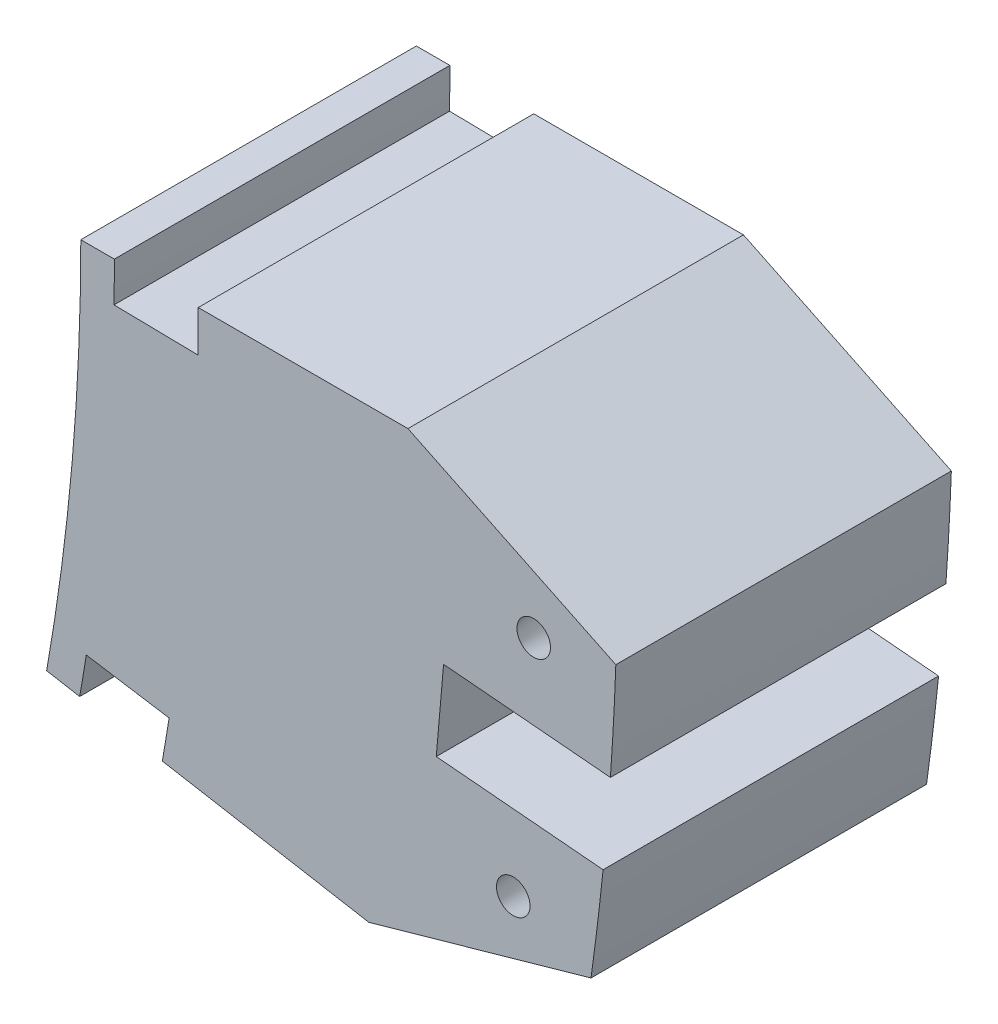
ISO-10303-21;
HEADER;
FILE_DESCRIPTION(('STEP AP214'),'2;1');
FILE_NAME('part.step','',(''),(''),'','','');
FILE_SCHEMA(('AUTOMOTIVE_DESIGN { 1 0 10303 214 1 1 1 1 }'));
ENDSEC;
DATA;
#1=APPLICATION_CONTEXT('core data for automotive mechanical design processes');
#2=APPLICATION_PROTOCOL_DEFINITION('international standard','automotive_design',2000,#1);
#3=PRODUCT_CONTEXT('',#1,'mechanical');
#4=PRODUCT('Part','Part','',(#3));
#5=PRODUCT_RELATED_PRODUCT_CATEGORY('part','',(#4));
#6=PRODUCT_DEFINITION_FORMATION('','',#4);
#7=PRODUCT_DEFINITION_CONTEXT('part definition',#1,'design');
#8=PRODUCT_DEFINITION('design','',#6,#7);
#9=PRODUCT_DEFINITION_SHAPE('','',#8);
#10=(LENGTH_UNIT() NAMED_UNIT(*) SI_UNIT(.MILLI.,.METRE.));
#11=(NAMED_UNIT(*) PLANE_ANGLE_UNIT() SI_UNIT($,.RADIAN.));
#12=(NAMED_UNIT(*) SI_UNIT($,.STERADIAN.) SOLID_ANGLE_UNIT());
#13=UNCERTAINTY_MEASURE_WITH_UNIT(LENGTH_MEASURE(1.E-05),#10,'distance_accuracy_value','');
#14=(GEOMETRIC_REPRESENTATION_CONTEXT(3) GLOBAL_UNCERTAINTY_ASSIGNED_CONTEXT((#13)) GLOBAL_UNIT_ASSIGNED_CONTEXT((#10,
#11,#12)) REPRESENTATION_CONTEXT('',''));
#15=CARTESIAN_POINT('',(0.,0.,0.));
#16=DIRECTION('',(0.,0.,1.));
#17=DIRECTION('',(1.,0.,0.));
#18=AXIS2_PLACEMENT_3D('',#15,#16,#17);
#19=CARTESIAN_POINT('',(670.,0.,100.));
#20=DIRECTION('',(0.,-1.,0.));
#21=DIRECTION('',(0.,0.,-1.));
#22=AXIS2_PLACEMENT_3D('',#19,#20,#21);
#23=PLANE('',#22);
#24=DIRECTION('',(0.,0.,1.));
#25=VECTOR('',#24,1.);
#26=CARTESIAN_POINT('',(767.5,0.,-0.001000000000001));
#27=LINE('',#26,#25);
#28=CARTESIAN_POINT('',(767.5,0.,0.));
#29=VERTEX_POINT('',#28);
#30=CARTESIAN_POINT('',(767.5,0.,100.));
#31=VERTEX_POINT('',#30);
#32=EDGE_CURVE('E160',#29,#31,#27,.T.);
#33=ORIENTED_EDGE('',*,*,#32,.F.);
#34=DIRECTION('',(-1.,0.,0.));
#35=VECTOR('',#34,1.);
#36=CARTESIAN_POINT('',(670.,0.,0.));
#37=LINE('',#36,#35);
#38=CARTESIAN_POINT('',(705.,0.,0.));
#39=VERTEX_POINT('',#38);
#40=EDGE_CURVE('E202',#29,#39,#37,.T.);
#41=ORIENTED_EDGE('',*,*,#40,.T.);
#42=DIRECTION('',(0.,0.,-1.));
#43=VECTOR('',#42,1.);
#44=CARTESIAN_POINT('',(705.,0.,100.));
#45=LINE('',#44,#43);
#46=CARTESIAN_POINT('',(705.,0.,100.));
#47=VERTEX_POINT('',#46);
#48=EDGE_CURVE('E277',#47,#39,#45,.T.);
#49=ORIENTED_EDGE('',*,*,#48,.F.);
#50=DIRECTION('',(-1.,0.,0.));
#51=VECTOR('',#50,1.);
#52=CARTESIAN_POINT('',(670.,0.,100.));
#53=LINE('',#52,#51);
#54=EDGE_CURVE('E189',#31,#47,#53,.T.);
#55=ORIENTED_EDGE('',*,*,#54,.F.);
#56=EDGE_LOOP('',(#33,#41,#49,#55));
#57=FACE_BOUND('',#56,.T.);
#58=ADVANCED_FACE('F34',(#57),#23,.F.);
#59=CARTESIAN_POINT('',(0.,0.,100.));
#60=DIRECTION('',(0.,0.,-1.));
#61=DIRECTION('',(-1.,0.,0.));
#62=AXIS2_PLACEMENT_3D('',#59,#60,#61);
#63=CYLINDRICAL_SURFACE('',#62,830.);
#64=DIRECTION('',(0.,0.,1.));
#65=VECTOR('',#64,1.);
#66=CARTESIAN_POINT('',(829.459141917816,-29.9588365755499,-0.001000000000001));
#67=LINE('',#66,#65);
#68=CARTESIAN_POINT('',(829.459141917816,-29.9588365755499,0.));
#69=VERTEX_POINT('',#68);
#70=CARTESIAN_POINT('',(829.459141917816,-29.9588365755499,100.));
#71=VERTEX_POINT('',#70);
#72=EDGE_CURVE('E49',#69,#71,#67,.T.);
#73=ORIENTED_EDGE('',*,*,#72,.T.);
#74=CARTESIAN_POINT('',(0.,0.,100.));
#75=DIRECTION('',(0.,0.,1.));
#76=DIRECTION('',(1.,0.,0.));
#77=AXIS2_PLACEMENT_3D('',#74,#75,#76);
#78=CIRCLE('',#77,830.);
#79=CARTESIAN_POINT('',(827.837272556722,-59.8786286236421,100.));
#80=VERTEX_POINT('',#79);
#81=EDGE_CURVE('E171',#80,#71,#78,.T.);
#82=ORIENTED_EDGE('',*,*,#81,.F.);
#83=DIRECTION('',(0.,0.,1.));
#84=VECTOR('',#83,1.);
#85=CARTESIAN_POINT('',(827.837272556722,-59.8786286236421,0.));
#86=LINE('',#85,#84);
#87=CARTESIAN_POINT('',(827.837272556722,-59.8786286236421,0.));
#88=VERTEX_POINT('',#87);
#89=EDGE_CURVE('E235',#88,#80,#86,.T.);
#90=ORIENTED_EDGE('',*,*,#89,.F.);
#91=CARTESIAN_POINT('',(0.,0.,0.));
#92=DIRECTION('',(0.,0.,1.));
#93=DIRECTION('',(1.,0.,0.));
#94=AXIS2_PLACEMENT_3D('',#91,#92,#93);
#95=CIRCLE('',#94,830.);
#96=EDGE_CURVE('E173',#88,#69,#95,.T.);
#97=ORIENTED_EDGE('',*,*,#96,.T.);
#98=EDGE_LOOP('',(#73,#82,#90,#97));
#99=FACE_BOUND('',#98,.T.);
#100=ADVANCED_FACE('F169',(#99),#63,.T.);
#101=CARTESIAN_POINT('',(0.,0.,100.));
#102=DIRECTION('',(0.,0.,1.));
#103=DIRECTION('',(1.,0.,0.));
#104=AXIS2_PLACEMENT_3D('',#101,#102,#103);
#105=PLANE('',#104);
#106=CARTESIAN_POINT('',(804.987182960023,-35.2935584786532,100.));
#107=DIRECTION('',(0.,0.,1.));
#108=DIRECTION('',(-0.984807753012208,0.173648177666931,0.));
#109=AXIS2_PLACEMENT_3D('',#106,#107,#108);
#110=CIRCLE('',#109,5.00000000000006);
#111=CARTESIAN_POINT('',(800.063144194962,-34.4253175903186,100.));
#112=VERTEX_POINT('',#111);
#113=EDGE_CURVE('E261',#112,#112,#110,.T.);
#114=ORIENTED_EDGE('',*,*,#113,.F.);
#115=EDGE_LOOP('',(#114));
#116=FACE_BOUND('',#115,.T.);
#117=CARTESIAN_POINT('',(798.886280967687,-105.027187345077,100.));
#118=DIRECTION('',(0.,0.,-1.));
#119=DIRECTION('',(-1.,0.,0.));
#120=AXIS2_PLACEMENT_3D('',#117,#118,#119);
#121=CIRCLE('',#120,5.00000000000006);
#122=CARTESIAN_POINT('',(793.886280967687,-105.027187345077,100.));
#123=VERTEX_POINT('',#122);
#124=EDGE_CURVE('E246',#123,#123,#121,.T.);
#125=ORIENTED_EDGE('',*,*,#124,.T.);
#126=EDGE_LOOP('',(#125));
#127=FACE_BOUND('',#126,.T.);
#128=ORIENTED_EDGE('',*,*,#81,.T.);
#129=DIRECTION('',(-0.900281092823237,0.435309032648069,0.));
#130=VECTOR('',#129,1.);
#131=CARTESIAN_POINT('',(145.436609622086,300.783627324666,100.));
#132=LINE('',#131,#130);
#133=EDGE_CURVE('E157',#71,#31,#132,.T.);
#134=ORIENTED_EDGE('',*,*,#133,.T.);
#135=ORIENTED_EDGE('',*,*,#54,.T.);
#136=CARTESIAN_POINT('',(0.,0.,100.));
#137=DIRECTION('',(0.,0.,-1.));
#138=DIRECTION('',(-1.,0.,0.));
#139=AXIS2_PLACEMENT_3D('',#136,#137,#138);
#140=CIRCLE('',#139,705.);
#141=CARTESIAN_POINT('',(704.892625085256,-12.3039465382994,100.));
#142=VERTEX_POINT('',#141);
#143=EDGE_CURVE('E274',#142,#47,#140,.F.);
#144=ORIENTED_EDGE('',*,*,#143,.F.);
#145=DIRECTION('',(0.999847695156391,-0.0174524064373041,0.));
#146=VECTOR('',#145,1.);
#147=CARTESIAN_POINT('',(0.,0.,100.));
#148=LINE('',#147,#146);
#149=CARTESIAN_POINT('',(679.896432706346,-11.8676363773668,100.));
#150=VERTEX_POINT('',#149);
#151=EDGE_CURVE('E287',#150,#142,#148,.T.);
#152=ORIENTED_EDGE('',*,*,#151,.F.);
#153=CARTESIAN_POINT('',(0.,0.,100.));
#154=DIRECTION('',(0.,0.,-1.));
#155=DIRECTION('',(-1.,0.,0.));
#156=AXIS2_PLACEMENT_3D('',#153,#154,#155);
#157=CIRCLE('',#156,680.);
#158=CARTESIAN_POINT('',(680.,0.,100.));
#159=VERTEX_POINT('',#158);
#160=EDGE_CURVE('E295',#150,#159,#157,.F.);
#161=ORIENTED_EDGE('',*,*,#160,.T.);
#162=CARTESIAN_POINT('',(670.,0.,100.));
#163=VERTEX_POINT('',#162);
#164=EDGE_CURVE('E183',#159,#163,#53,.T.);
#165=ORIENTED_EDGE('',*,*,#164,.T.);
#166=CARTESIAN_POINT('',(0.,0.,100.));
#167=DIRECTION('',(0.,0.,-1.));
#168=DIRECTION('',(1.,0.,0.));
#169=AXIS2_PLACEMENT_3D('',#166,#167,#168);
#170=CIRCLE('',#169,670.);
#171=CARTESIAN_POINT('',(659.821194518179,-116.344279036844,100.));
#172=VERTEX_POINT('',#171);
#173=EDGE_CURVE('E203',#163,#172,#170,.T.);
#174=ORIENTED_EDGE('',*,*,#173,.T.);
#175=DIRECTION('',(0.984807753012208,-0.173648177666931,0.));
#176=VECTOR('',#175,1.);
#177=CARTESIAN_POINT('',(659.821194518179,-116.344279036844,100.));
#178=LINE('',#177,#176);
#179=CARTESIAN_POINT('',(669.669272048302,-118.080760813513,100.));
#180=VERTEX_POINT('',#179);
#181=EDGE_CURVE('E181',#172,#180,#178,.T.);
#182=ORIENTED_EDGE('',*,*,#181,.T.);
#183=CARTESIAN_POINT('',(0.,0.,100.));
#184=DIRECTION('',(0.,0.,-1.));
#185=DIRECTION('',(-1.,0.,0.));
#186=AXIS2_PLACEMENT_3D('',#183,#184,#185);
#187=CIRCLE('',#186,680.);
#188=CARTESIAN_POINT('',(671.628071604693,-106.375436227344,100.));
#189=VERTEX_POINT('',#188);
#190=EDGE_CURVE('E301',#189,#180,#187,.T.);
#191=ORIENTED_EDGE('',*,*,#190,.F.);
#192=DIRECTION('',(0.987688340595141,-0.156434465040212,0.));
#193=VECTOR('',#192,1.);
#194=CARTESIAN_POINT('',(0.,0.,100.));
#195=LINE('',#194,#193);
#196=CARTESIAN_POINT('',(696.320280119572,-110.286297853349,100.));
#197=VERTEX_POINT('',#196);
#198=EDGE_CURVE('E307',#189,#197,#195,.T.);
#199=ORIENTED_EDGE('',*,*,#198,.T.);
#200=CARTESIAN_POINT('',(0.,0.,100.));
#201=DIRECTION('',(0.,0.,-1.));
#202=DIRECTION('',(-1.,0.,0.));
#203=AXIS2_PLACEMENT_3D('',#200,#201,#202);
#204=CIRCLE('',#203,705.);
#205=CARTESIAN_POINT('',(694.289465873607,-122.421965255186,100.));
#206=VERTEX_POINT('',#205);
#207=EDGE_CURVE('E313',#197,#206,#204,.T.);
#208=ORIENTED_EDGE('',*,*,#207,.T.);
#209=CARTESIAN_POINT('',(755.83995043687,-133.274976359369,100.));
#210=VERTEX_POINT('',#209);
#211=EDGE_CURVE('E185',#206,#210,#178,.T.);
#212=ORIENTED_EDGE('',*,*,#211,.T.);
#213=DIRECTION('',(-0.962194420343921,-0.272363539151308,0.));
#214=VECTOR('',#213,1.);
#215=CARTESIAN_POINT('',(90.9965719706589,-321.468850395394,100.));
#216=LINE('',#215,#214);
#217=CARTESIAN_POINT('',(822.060091143884,-114.530373912378,100.));
#218=VERTEX_POINT('',#217);
#219=EDGE_CURVE('E322',#218,#210,#216,.T.);
#220=ORIENTED_EDGE('',*,*,#219,.F.);
#221=CARTESIAN_POINT('',(825.65837898803,-84.7834960759358,100.));
#222=VERTEX_POINT('',#221);
#223=EDGE_CURVE('E180',#218,#222,#78,.T.);
#224=ORIENTED_EDGE('',*,*,#223,.T.);
#225=DIRECTION('',(0.996194698091746,-0.0871557427476585,0.));
#226=VECTOR('',#225,1.);
#227=CARTESIAN_POINT('',(-1.08944678434574,-12.4524337261469,100.));
#228=LINE('',#227,#226);
#229=CARTESIAN_POINT('',(775.942417727216,-80.4339130693205,100.));
#230=VERTEX_POINT('',#229);
#231=EDGE_CURVE('E240',#230,#222,#228,.T.);
#232=ORIENTED_EDGE('',*,*,#231,.F.);
#233=DIRECTION('',(-0.0871557427476599,-0.996194698091746,0.));
#234=VECTOR('',#233,1.);
#235=CARTESIAN_POINT('',(777.031864511561,-67.9814793431747,100.));
#236=LINE('',#235,#234);
#237=CARTESIAN_POINT('',(778.121311295907,-55.5290456170269,100.));
#238=VERTEX_POINT('',#237);
#239=EDGE_CURVE('E243',#238,#230,#236,.T.);
#240=ORIENTED_EDGE('',*,*,#239,.F.);
#241=DIRECTION('',(0.996194698091746,-0.0871557427476581,0.));
#242=VECTOR('',#241,1.);
#243=CARTESIAN_POINT('',(1.08944678434569,12.4524337261465,100.));
#244=LINE('',#243,#242);
#245=EDGE_CURVE('E179',#238,#80,#244,.T.);
#246=ORIENTED_EDGE('',*,*,#245,.T.);
#247=EDGE_LOOP('',(#128,#134,#135,#144,#152,#161,#165,#174,#182,#191,#199,#208,#212,#220,#224,
#232,#240,#246));
#248=FACE_BOUND('',#247,.T.);
#249=ADVANCED_FACE('F176',(#116,#127,#248),#105,.T.);
#250=CARTESIAN_POINT('',(0.,0.,0.));
#251=DIRECTION('',(0.,0.,1.));
#252=DIRECTION('',(1.,0.,0.));
#253=AXIS2_PLACEMENT_3D('',#250,#251,#252);
#254=PLANE('',#253);
#255=CARTESIAN_POINT('',(798.886280967687,-105.027187345077,0.));
#256=DIRECTION('',(0.,0.,-1.));
#257=DIRECTION('',(-1.,0.,0.));
#258=AXIS2_PLACEMENT_3D('',#255,#256,#257);
#259=CIRCLE('',#258,13.6824088833464);
#260=CARTESIAN_POINT('',(785.20387208434,-105.027187345077,0.));
#261=VERTEX_POINT('',#260);
#262=EDGE_CURVE('E258',#261,#261,#259,.T.);
#263=ORIENTED_EDGE('',*,*,#262,.F.);
#264=EDGE_LOOP('',(#263));
#265=FACE_BOUND('',#264,.T.);
#266=CARTESIAN_POINT('',(804.987182960023,-35.2935584786532,0.));
#267=DIRECTION('',(0.,0.,1.));
#268=DIRECTION('',(-0.984807753012208,0.173648177666931,0.));
#269=AXIS2_PLACEMENT_3D('',#266,#267,#268);
#270=CIRCLE('',#269,13.6824088833464);
#271=CARTESIAN_POINT('',(791.51264061182,-32.9176331099663,0.));
#272=VERTEX_POINT('',#271);
#273=EDGE_CURVE('E267',#272,#272,#270,.T.);
#274=ORIENTED_EDGE('',*,*,#273,.T.);
#275=EDGE_LOOP('',(#274));
#276=FACE_BOUND('',#275,.T.);
#277=DIRECTION('',(0.900281092823237,-0.435309032648069,0.));
#278=VECTOR('',#277,1.);
#279=CARTESIAN_POINT('',(145.436609622086,300.783627324666,0.));
#280=LINE('',#279,#278);
#281=EDGE_CURVE('E164',#29,#69,#280,.T.);
#282=ORIENTED_EDGE('',*,*,#281,.T.);
#283=ORIENTED_EDGE('',*,*,#96,.F.);
#284=DIRECTION('',(0.996194698091746,-0.0871557427476581,0.));
#285=VECTOR('',#284,1.);
#286=CARTESIAN_POINT('',(1.08944678434569,12.4524337261465,0.));
#287=LINE('',#286,#285);
#288=CARTESIAN_POINT('',(778.121311295907,-55.5290456170269,0.));
#289=VERTEX_POINT('',#288);
#290=EDGE_CURVE('E232',#289,#88,#287,.T.);
#291=ORIENTED_EDGE('',*,*,#290,.F.);
#292=DIRECTION('',(-0.0871557427476599,-0.996194698091746,0.));
#293=VECTOR('',#292,1.);
#294=CARTESIAN_POINT('',(777.031864511561,-67.9814793431747,0.));
#295=LINE('',#294,#293);
#296=CARTESIAN_POINT('',(775.942417727216,-80.4339130693205,0.));
#297=VERTEX_POINT('',#296);
#298=EDGE_CURVE('E239',#289,#297,#295,.T.);
#299=ORIENTED_EDGE('',*,*,#298,.T.);
#300=DIRECTION('',(0.996194698091746,-0.0871557427476585,0.));
#301=VECTOR('',#300,1.);
#302=CARTESIAN_POINT('',(-1.08944678434574,-12.4524337261469,0.));
#303=LINE('',#302,#301);
#304=CARTESIAN_POINT('',(825.65837898803,-84.7834960759358,0.));
#305=VERTEX_POINT('',#304);
#306=EDGE_CURVE('E248',#297,#305,#303,.T.);
#307=ORIENTED_EDGE('',*,*,#306,.T.);
#308=CARTESIAN_POINT('',(822.060091143884,-114.530373912378,0.));
#309=VERTEX_POINT('',#308);
#310=EDGE_CURVE('E199',#309,#305,#95,.T.);
#311=ORIENTED_EDGE('',*,*,#310,.F.);
#312=DIRECTION('',(0.962194420343921,0.272363539151308,0.));
#313=VECTOR('',#312,1.);
#314=CARTESIAN_POINT('',(90.9965719706589,-321.468850395394,0.));
#315=LINE('',#314,#313);
#316=CARTESIAN_POINT('',(755.83995043687,-133.274976359369,0.));
#317=VERTEX_POINT('',#316);
#318=EDGE_CURVE('E57',#317,#309,#315,.T.);
#319=ORIENTED_EDGE('',*,*,#318,.F.);
#320=DIRECTION('',(0.984807753012208,-0.173648177666931,0.));
#321=VECTOR('',#320,1.);
#322=CARTESIAN_POINT('',(659.821194518179,-116.344279036844,0.));
#323=LINE('',#322,#321);
#324=CARTESIAN_POINT('',(694.289465873607,-122.421965255186,0.));
#325=VERTEX_POINT('',#324);
#326=EDGE_CURVE('E194',#325,#317,#323,.T.);
#327=ORIENTED_EDGE('',*,*,#326,.F.);
#328=CARTESIAN_POINT('',(0.,0.,0.));
#329=DIRECTION('',(0.,0.,-1.));
#330=DIRECTION('',(-1.,0.,0.));
#331=AXIS2_PLACEMENT_3D('',#328,#329,#330);
#332=CIRCLE('',#331,705.);
#333=CARTESIAN_POINT('',(696.320280119572,-110.286297853349,0.));
#334=VERTEX_POINT('',#333);
#335=EDGE_CURVE('E308',#334,#325,#332,.T.);
#336=ORIENTED_EDGE('',*,*,#335,.F.);
#337=DIRECTION('',(0.987688340595141,-0.156434465040212,0.));
#338=VECTOR('',#337,1.);
#339=CARTESIAN_POINT('',(0.,0.,0.));
#340=LINE('',#339,#338);
#341=CARTESIAN_POINT('',(671.628071604693,-106.375436227344,0.));
#342=VERTEX_POINT('',#341);
#343=EDGE_CURVE('E283',#342,#334,#340,.T.);
#344=ORIENTED_EDGE('',*,*,#343,.F.);
#345=CARTESIAN_POINT('',(0.,0.,0.));
#346=DIRECTION('',(0.,0.,-1.));
#347=DIRECTION('',(-1.,0.,0.));
#348=AXIS2_PLACEMENT_3D('',#345,#346,#347);
#349=CIRCLE('',#348,680.);
#350=CARTESIAN_POINT('',(669.669272048302,-118.080760813513,0.));
#351=VERTEX_POINT('',#350);
#352=EDGE_CURVE('E220',#342,#351,#349,.T.);
#353=ORIENTED_EDGE('',*,*,#352,.T.);
#354=CARTESIAN_POINT('',(659.821194518179,-116.344279036844,0.));
#355=VERTEX_POINT('',#354);
#356=EDGE_CURVE('E196',#355,#351,#323,.T.);
#357=ORIENTED_EDGE('',*,*,#356,.F.);
#358=CARTESIAN_POINT('',(0.,0.,0.));
#359=DIRECTION('',(0.,0.,-1.));
#360=DIRECTION('',(1.,0.,0.));
#361=AXIS2_PLACEMENT_3D('',#358,#359,#360);
#362=CIRCLE('',#361,670.);
#363=CARTESIAN_POINT('',(670.,0.,0.));
#364=VERTEX_POINT('',#363);
#365=EDGE_CURVE('E191',#364,#355,#362,.T.);
#366=ORIENTED_EDGE('',*,*,#365,.F.);
#367=CARTESIAN_POINT('',(680.,0.,0.));
#368=VERTEX_POINT('',#367);
#369=EDGE_CURVE('E201',#368,#364,#37,.T.);
#370=ORIENTED_EDGE('',*,*,#369,.F.);
#371=CARTESIAN_POINT('',(0.,0.,0.));
#372=DIRECTION('',(0.,0.,-1.));
#373=DIRECTION('',(-1.,0.,0.));
#374=AXIS2_PLACEMENT_3D('',#371,#372,#373);
#375=CIRCLE('',#374,680.);
#376=CARTESIAN_POINT('',(679.896432706346,-11.8676363773668,0.));
#377=VERTEX_POINT('',#376);
#378=EDGE_CURVE('E288',#377,#368,#375,.F.);
#379=ORIENTED_EDGE('',*,*,#378,.F.);
#380=DIRECTION('',(0.999847695156391,-0.0174524064373041,0.));
#381=VECTOR('',#380,1.);
#382=CARTESIAN_POINT('',(0.,0.,0.));
#383=LINE('',#382,#381);
#384=CARTESIAN_POINT('',(704.892625085256,-12.3039465382994,0.));
#385=VERTEX_POINT('',#384);
#386=EDGE_CURVE('E290',#377,#385,#383,.T.);
#387=ORIENTED_EDGE('',*,*,#386,.T.);
#388=CARTESIAN_POINT('',(0.,0.,0.));
#389=DIRECTION('',(0.,0.,-1.));
#390=DIRECTION('',(-1.,0.,0.));
#391=AXIS2_PLACEMENT_3D('',#388,#389,#390);
#392=CIRCLE('',#391,705.);
#393=EDGE_CURVE('E284',#385,#39,#392,.F.);
#394=ORIENTED_EDGE('',*,*,#393,.T.);
#395=ORIENTED_EDGE('',*,*,#40,.F.);
#396=EDGE_LOOP('',(#282,#283,#291,#299,#307,#311,#319,#327,#336,#344,#353,#357,#366,#370,#379,
#387,#394,#395));
#397=FACE_BOUND('',#396,.T.);
#398=ADVANCED_FACE('F215',(#265,#276,#397),#254,.F.);
#399=CARTESIAN_POINT('',(659.821194518179,-116.344279036844,100.));
#400=DIRECTION('',(0.173648177666931,0.984807753012208,0.));
#401=DIRECTION('',(-0.984807753012208,0.173648177666931,0.));
#402=AXIS2_PLACEMENT_3D('',#399,#400,#401);
#403=PLANE('',#402);
#404=DIRECTION('',(0.,0.,-1.));
#405=VECTOR('',#404,1.);
#406=CARTESIAN_POINT('',(669.669272048302,-118.080760813513,100.));
#407=LINE('',#406,#405);
#408=EDGE_CURVE('E224',#180,#351,#407,.T.);
#409=ORIENTED_EDGE('',*,*,#408,.F.);
#410=ORIENTED_EDGE('',*,*,#181,.F.);
#411=DIRECTION('',(0.,0.,-1.));
#412=VECTOR('',#411,1.);
#413=CARTESIAN_POINT('',(659.821194518179,-116.344279036844,100.));
#414=LINE('',#413,#412);
#415=EDGE_CURVE('E11',#172,#355,#414,.T.);
#416=ORIENTED_EDGE('',*,*,#415,.T.);
#417=ORIENTED_EDGE('',*,*,#356,.T.);
#418=EDGE_LOOP('',(#409,#410,#416,#417));
#419=FACE_BOUND('',#418,.T.);
#420=ADVANCED_FACE('F223',(#419),#403,.F.);
#421=CARTESIAN_POINT('',(0.,0.,100.));
#422=DIRECTION('',(0.,0.,-1.));
#423=DIRECTION('',(-1.,0.,0.));
#424=AXIS2_PLACEMENT_3D('',#421,#422,#423);
#425=CYLINDRICAL_SURFACE('',#424,670.);
#426=ORIENTED_EDGE('',*,*,#365,.T.);
#427=ORIENTED_EDGE('',*,*,#415,.F.);
#428=ORIENTED_EDGE('',*,*,#173,.F.);
#429=DIRECTION('',(0.,0.,-1.));
#430=VECTOR('',#429,1.);
#431=CARTESIAN_POINT('',(670.,0.,100.));
#432=LINE('',#431,#430);
#433=EDGE_CURVE('E42',#163,#364,#432,.T.);
#434=ORIENTED_EDGE('',*,*,#433,.T.);
#435=EDGE_LOOP('',(#426,#427,#428,#434));
#436=FACE_BOUND('',#435,.T.);
#437=ADVANCED_FACE('F36',(#436),#425,.F.);
#438=ORIENTED_EDGE('',*,*,#326,.T.);
#439=DIRECTION('',(0.,0.,1.));
#440=VECTOR('',#439,1.);
#441=CARTESIAN_POINT('',(755.83995043687,-133.274976359369,-0.001000000000001));
#442=LINE('',#441,#440);
#443=EDGE_CURVE('E319',#317,#210,#442,.T.);
#444=ORIENTED_EDGE('',*,*,#443,.T.);
#445=ORIENTED_EDGE('',*,*,#211,.F.);
#446=DIRECTION('',(0.,0.,-1.));
#447=VECTOR('',#446,1.);
#448=CARTESIAN_POINT('',(694.289465873607,-122.421965255186,100.));
#449=LINE('',#448,#447);
#450=EDGE_CURVE('E300',#206,#325,#449,.T.);
#451=ORIENTED_EDGE('',*,*,#450,.T.);
#452=EDGE_LOOP('',(#438,#444,#445,#451));
#453=FACE_BOUND('',#452,.T.);
#454=ADVANCED_FACE('F355',(#453),#403,.F.);
#455=ORIENTED_EDGE('',*,*,#223,.F.);
#456=DIRECTION('',(0.,0.,1.));
#457=VECTOR('',#456,1.);
#458=CARTESIAN_POINT('',(822.060091143884,-114.530373912378,-0.001000000000001));
#459=LINE('',#458,#457);
#460=EDGE_CURVE('E320',#309,#218,#459,.T.);
#461=ORIENTED_EDGE('',*,*,#460,.F.);
#462=ORIENTED_EDGE('',*,*,#310,.T.);
#463=DIRECTION('',(0.,0.,1.));
#464=VECTOR('',#463,1.);
#465=CARTESIAN_POINT('',(825.65837898803,-84.7834960759358,0.));
#466=LINE('',#465,#464);
#467=EDGE_CURVE('E231',#305,#222,#466,.T.);
#468=ORIENTED_EDGE('',*,*,#467,.T.);
#469=EDGE_LOOP('',(#455,#461,#462,#468));
#470=FACE_BOUND('',#469,.T.);
#471=ADVANCED_FACE('F345',(#470),#63,.T.);
#472=ORIENTED_EDGE('',*,*,#164,.F.);
#473=DIRECTION('',(0.,0.,-1.));
#474=VECTOR('',#473,1.);
#475=CARTESIAN_POINT('',(680.,0.,100.));
#476=LINE('',#475,#474);
#477=EDGE_CURVE('E273',#159,#368,#476,.T.);
#478=ORIENTED_EDGE('',*,*,#477,.T.);
#479=ORIENTED_EDGE('',*,*,#369,.T.);
#480=ORIENTED_EDGE('',*,*,#433,.F.);
#481=EDGE_LOOP('',(#472,#478,#479,#480));
#482=FACE_BOUND('',#481,.T.);
#483=ADVANCED_FACE('F342',(#482),#23,.F.);
#484=CARTESIAN_POINT('',(777.031864511561,-67.9814793431747,0.));
#485=DIRECTION('',(-0.996194698091745,0.0871557427476599,0.));
#486=DIRECTION('',(-0.0871557427476599,-0.996194698091746,0.));
#487=AXIS2_PLACEMENT_3D('',#484,#485,#486);
#488=PLANE('',#487);
#489=ORIENTED_EDGE('',*,*,#239,.T.);
#490=DIRECTION('',(0.,0.,1.));
#491=VECTOR('',#490,1.);
#492=CARTESIAN_POINT('',(775.942417727216,-80.4339130693205,0.));
#493=LINE('',#492,#491);
#494=EDGE_CURVE('E229',#297,#230,#493,.T.);
#495=ORIENTED_EDGE('',*,*,#494,.F.);
#496=ORIENTED_EDGE('',*,*,#298,.F.);
#497=DIRECTION('',(0.,0.,1.));
#498=VECTOR('',#497,1.);
#499=CARTESIAN_POINT('',(778.121311295907,-55.5290456170269,0.));
#500=LINE('',#499,#498);
#501=EDGE_CURVE('E195',#289,#238,#500,.T.);
#502=ORIENTED_EDGE('',*,*,#501,.T.);
#503=EDGE_LOOP('',(#489,#495,#496,#502));
#504=FACE_BOUND('',#503,.T.);
#505=ADVANCED_FACE('F344',(#504),#488,.F.);
#506=CARTESIAN_POINT('',(1.08944678434569,12.4524337261465,0.));
#507=DIRECTION('',(-0.0871557427476581,-0.996194698091745,0.));
#508=DIRECTION('',(0.996194698091746,-0.0871557427476581,0.));
#509=AXIS2_PLACEMENT_3D('',#506,#507,#508);
#510=PLANE('',#509);
#511=ORIENTED_EDGE('',*,*,#245,.F.);
#512=ORIENTED_EDGE('',*,*,#501,.F.);
#513=ORIENTED_EDGE('',*,*,#290,.T.);
#514=ORIENTED_EDGE('',*,*,#89,.T.);
#515=EDGE_LOOP('',(#511,#512,#513,#514));
#516=FACE_BOUND('',#515,.T.);
#517=ADVANCED_FACE('F351',(#516),#510,.T.);
#518=CARTESIAN_POINT('',(-1.08944678434574,-12.4524337261469,0.));
#519=DIRECTION('',(-0.0871557427476584,-0.996194698091745,0.));
#520=DIRECTION('',(0.996194698091746,-0.0871557427476584,0.));
#521=AXIS2_PLACEMENT_3D('',#518,#519,#520);
#522=PLANE('',#521);
#523=ORIENTED_EDGE('',*,*,#231,.T.);
#524=ORIENTED_EDGE('',*,*,#467,.F.);
#525=ORIENTED_EDGE('',*,*,#306,.F.);
#526=ORIENTED_EDGE('',*,*,#494,.T.);
#527=EDGE_LOOP('',(#523,#524,#525,#526));
#528=FACE_BOUND('',#527,.T.);
#529=ADVANCED_FACE('F385',(#528),#522,.F.);
#530=CARTESIAN_POINT('',(798.886280967687,-105.027187345077,50.7596123493896));
#531=DIRECTION('',(0.,0.,-1.));
#532=DIRECTION('',(-1.,0.,0.));
#533=AXIS2_PLACEMENT_3D('',#530,#531,#532);
#534=CONICAL_SURFACE('',#533,13.6824088833464,0.174532925199429);
#535=ORIENTED_EDGE('',*,*,#124,.F.);
#536=EDGE_LOOP('',(#535));
#537=FACE_BOUND('',#536,.T.);
#538=CARTESIAN_POINT('',(798.886280967687,-105.027187345077,50.7596123493896));
#539=DIRECTION('',(0.,0.,-1.));
#540=DIRECTION('',(-1.,0.,0.));
#541=AXIS2_PLACEMENT_3D('',#538,#539,#540);
#542=CIRCLE('',#541,13.6824088833464);
#543=CARTESIAN_POINT('',(785.20387208434,-105.027187345077,50.7596123493896));
#544=VERTEX_POINT('',#543);
#545=EDGE_CURVE('E255',#544,#544,#542,.T.);
#546=ORIENTED_EDGE('',*,*,#545,.T.);
#547=EDGE_LOOP('',(#546));
#548=FACE_BOUND('',#547,.T.);
#549=ADVANCED_FACE('F388',(#537,#548),#534,.F.);
#550=CARTESIAN_POINT('',(798.886280967687,-105.027187345077,0.));
#551=DIRECTION('',(0.,0.,-1.));
#552=DIRECTION('',(-1.,0.,0.));
#553=AXIS2_PLACEMENT_3D('',#550,#551,#552);
#554=CYLINDRICAL_SURFACE('',#553,13.6824088833464);
#555=ORIENTED_EDGE('',*,*,#545,.F.);
#556=EDGE_LOOP('',(#555));
#557=FACE_BOUND('',#556,.T.);
#558=ORIENTED_EDGE('',*,*,#262,.T.);
#559=EDGE_LOOP('',(#558));
#560=FACE_BOUND('',#559,.T.);
#561=ADVANCED_FACE('F395',(#557,#560),#554,.F.);
#562=CARTESIAN_POINT('',(804.987182960023,-35.2935584786532,50.7596123493896));
#563=DIRECTION('',(0.,0.,-1.));
#564=DIRECTION('',(-0.984807753012208,0.173648177666931,0.));
#565=AXIS2_PLACEMENT_3D('',#562,#563,#564);
#566=CONICAL_SURFACE('',#565,13.6824088833464,0.174532925199429);
#567=ORIENTED_EDGE('',*,*,#113,.T.);
#568=EDGE_LOOP('',(#567));
#569=FACE_BOUND('',#568,.T.);
#570=CARTESIAN_POINT('',(804.987182960023,-35.2935584786532,50.7596123493896));
#571=DIRECTION('',(0.,0.,1.));
#572=DIRECTION('',(-0.984807753012208,0.173648177666931,0.));
#573=AXIS2_PLACEMENT_3D('',#570,#571,#572);
#574=CIRCLE('',#573,13.6824088833464);
#575=CARTESIAN_POINT('',(791.51264061182,-32.9176331099663,50.7596123493896));
#576=VERTEX_POINT('',#575);
#577=EDGE_CURVE('E264',#576,#576,#574,.T.);
#578=ORIENTED_EDGE('',*,*,#577,.F.);
#579=EDGE_LOOP('',(#578));
#580=FACE_BOUND('',#579,.T.);
#581=ADVANCED_FACE('F399',(#569,#580),#566,.F.);
#582=CARTESIAN_POINT('',(804.987182960023,-35.2935584786532,0.));
#583=DIRECTION('',(0.,0.,-1.));
#584=DIRECTION('',(-0.984807753012208,0.173648177666931,0.));
#585=AXIS2_PLACEMENT_3D('',#582,#583,#584);
#586=CYLINDRICAL_SURFACE('',#585,13.6824088833464);
#587=ORIENTED_EDGE('',*,*,#577,.T.);
#588=EDGE_LOOP('',(#587));
#589=FACE_BOUND('',#588,.T.);
#590=ORIENTED_EDGE('',*,*,#273,.F.);
#591=EDGE_LOOP('',(#590));
#592=FACE_BOUND('',#591,.T.);
#593=ADVANCED_FACE('F403',(#589,#592),#586,.F.);
#594=CARTESIAN_POINT('',(0.,0.,100.));
#595=DIRECTION('',(0.0174524064373041,0.999847695156391,0.));
#596=DIRECTION('',(-0.999847695156391,0.0174524064373041,0.));
#597=AXIS2_PLACEMENT_3D('',#594,#595,#596);
#598=PLANE('',#597);
#599=ORIENTED_EDGE('',*,*,#386,.F.);
#600=DIRECTION('',(0.,0.,-1.));
#601=VECTOR('',#600,1.);
#602=CARTESIAN_POINT('',(679.896432706346,-11.8676363773668,100.));
#603=LINE('',#602,#601);
#604=EDGE_CURVE('E271',#150,#377,#603,.T.);
#605=ORIENTED_EDGE('',*,*,#604,.F.);
#606=ORIENTED_EDGE('',*,*,#151,.T.);
#607=DIRECTION('',(0.,0.,-1.));
#608=VECTOR('',#607,1.);
#609=CARTESIAN_POINT('',(704.892625085256,-12.3039465382994,100.));
#610=LINE('',#609,#608);
#611=EDGE_CURVE('E280',#142,#385,#610,.T.);
#612=ORIENTED_EDGE('',*,*,#611,.T.);
#613=EDGE_LOOP('',(#599,#605,#606,#612));
#614=FACE_BOUND('',#613,.T.);
#615=ADVANCED_FACE('F338',(#614),#598,.T.);
#616=CARTESIAN_POINT('',(0.,0.,100.));
#617=DIRECTION('',(0.,0.,-1.));
#618=DIRECTION('',(-1.,0.,0.));
#619=AXIS2_PLACEMENT_3D('',#616,#617,#618);
#620=CYLINDRICAL_SURFACE('',#619,705.);
#621=ORIENTED_EDGE('',*,*,#393,.F.);
#622=ORIENTED_EDGE('',*,*,#611,.F.);
#623=ORIENTED_EDGE('',*,*,#143,.T.);
#624=ORIENTED_EDGE('',*,*,#48,.T.);
#625=EDGE_LOOP('',(#621,#622,#623,#624));
#626=FACE_BOUND('',#625,.T.);
#627=ADVANCED_FACE('F335',(#626),#620,.F.);
#628=CARTESIAN_POINT('',(0.,0.,100.));
#629=DIRECTION('',(0.,0.,-1.));
#630=DIRECTION('',(-1.,0.,0.));
#631=AXIS2_PLACEMENT_3D('',#628,#629,#630);
#632=CYLINDRICAL_SURFACE('',#631,680.);
#633=ORIENTED_EDGE('',*,*,#378,.T.);
#634=ORIENTED_EDGE('',*,*,#477,.F.);
#635=ORIENTED_EDGE('',*,*,#160,.F.);
#636=ORIENTED_EDGE('',*,*,#604,.T.);
#637=EDGE_LOOP('',(#633,#634,#635,#636));
#638=FACE_BOUND('',#637,.T.);
#639=ADVANCED_FACE('F340',(#638),#632,.T.);
#640=CARTESIAN_POINT('',(0.,0.,100.));
#641=DIRECTION('',(0.156434465040212,0.987688340595141,0.));
#642=DIRECTION('',(-0.987688340595141,0.156434465040212,0.));
#643=AXIS2_PLACEMENT_3D('',#640,#641,#642);
#644=PLANE('',#643);
#645=ORIENTED_EDGE('',*,*,#343,.T.);
#646=DIRECTION('',(0.,0.,-1.));
#647=VECTOR('',#646,1.);
#648=CARTESIAN_POINT('',(696.320280119572,-110.286297853349,100.));
#649=LINE('',#648,#647);
#650=EDGE_CURVE('E298',#197,#334,#649,.T.);
#651=ORIENTED_EDGE('',*,*,#650,.F.);
#652=ORIENTED_EDGE('',*,*,#198,.F.);
#653=DIRECTION('',(0.,0.,-1.));
#654=VECTOR('',#653,1.);
#655=CARTESIAN_POINT('',(671.628071604693,-106.375436227344,100.));
#656=LINE('',#655,#654);
#657=EDGE_CURVE('E270',#189,#342,#656,.T.);
#658=ORIENTED_EDGE('',*,*,#657,.T.);
#659=EDGE_LOOP('',(#645,#651,#652,#658));
#660=FACE_BOUND('',#659,.T.);
#661=ADVANCED_FACE('F412',(#660),#644,.F.);
#662=CARTESIAN_POINT('',(0.,0.,100.));
#663=DIRECTION('',(0.,0.,-1.));
#664=DIRECTION('',(-1.,0.,0.));
#665=AXIS2_PLACEMENT_3D('',#662,#663,#664);
#666=CYLINDRICAL_SURFACE('',#665,680.);
#667=ORIENTED_EDGE('',*,*,#352,.F.);
#668=ORIENTED_EDGE('',*,*,#657,.F.);
#669=ORIENTED_EDGE('',*,*,#190,.T.);
#670=ORIENTED_EDGE('',*,*,#408,.T.);
#671=EDGE_LOOP('',(#667,#668,#669,#670));
#672=FACE_BOUND('',#671,.T.);
#673=ADVANCED_FACE('F417',(#672),#666,.T.);
#674=CARTESIAN_POINT('',(0.,0.,100.));
#675=DIRECTION('',(0.,0.,-1.));
#676=DIRECTION('',(-1.,0.,0.));
#677=AXIS2_PLACEMENT_3D('',#674,#675,#676);
#678=CYLINDRICAL_SURFACE('',#677,705.);
#679=ORIENTED_EDGE('',*,*,#335,.T.);
#680=ORIENTED_EDGE('',*,*,#450,.F.);
#681=ORIENTED_EDGE('',*,*,#207,.F.);
#682=ORIENTED_EDGE('',*,*,#650,.T.);
#683=EDGE_LOOP('',(#679,#680,#681,#682));
#684=FACE_BOUND('',#683,.T.);
#685=ADVANCED_FACE('F419',(#684),#678,.F.);
#686=CARTESIAN_POINT('',(90.9965719706589,-321.468850395394,-0.001000000000001));
#687=DIRECTION('',(-0.272363539151308,0.962194420343921,0.));
#688=DIRECTION('',(-0.962194420343921,-0.272363539151308,0.));
#689=AXIS2_PLACEMENT_3D('',#686,#687,#688);
#690=PLANE('',#689);
#691=ORIENTED_EDGE('',*,*,#318,.T.);
#692=ORIENTED_EDGE('',*,*,#460,.T.);
#693=ORIENTED_EDGE('',*,*,#219,.T.);
#694=ORIENTED_EDGE('',*,*,#443,.F.);
#695=EDGE_LOOP('',(#691,#692,#693,#694));
#696=FACE_BOUND('',#695,.T.);
#697=ADVANCED_FACE('F422',(#696),#690,.F.);
#698=CARTESIAN_POINT('',(145.436609622086,300.783627324666,-0.001000000000001));
#699=DIRECTION('',(0.435309032648069,0.900281092823237,0.));
#700=DIRECTION('',(-0.900281092823237,0.435309032648069,0.));
#701=AXIS2_PLACEMENT_3D('',#698,#699,#700);
#702=PLANE('',#701);
#703=ORIENTED_EDGE('',*,*,#32,.T.);
#704=ORIENTED_EDGE('',*,*,#133,.F.);
#705=ORIENTED_EDGE('',*,*,#72,.F.);
#706=ORIENTED_EDGE('',*,*,#281,.F.);
#707=EDGE_LOOP('',(#703,#704,#705,#706));
#708=FACE_BOUND('',#707,.T.);
#709=ADVANCED_FACE('F158',(#708),#702,.T.);
#710=CLOSED_SHELL('',(#58,#100,#249,#398,#420,#437,#454,#471,#483,#505,#517,#529,#549,#561,#581,
#593,#615,#627,#639,#661,#673,#685,#697,#709));
#711=MANIFOLD_SOLID_BREP('B2',#710);
#712=ADVANCED_BREP_SHAPE_REPRESENTATION('',(#18,#711),#14);
#713=SHAPE_DEFINITION_REPRESENTATION(#9,#712);
ENDSEC;
END-ISO-10303-21;
